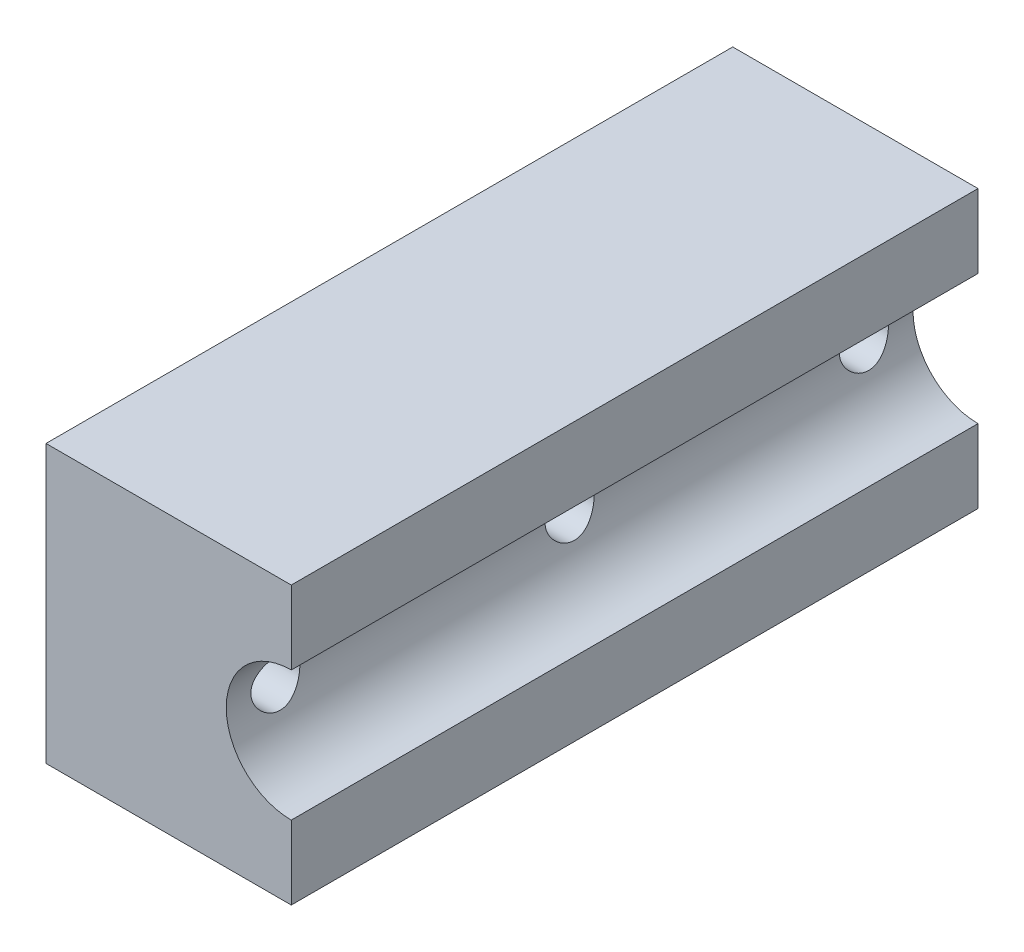
ISO-10303-21;
HEADER;
FILE_DESCRIPTION(('STEP AP214'),'2;1');
FILE_NAME('part.step','',(''),(''),'','','');
FILE_SCHEMA(('AUTOMOTIVE_DESIGN { 1 0 10303 214 1 1 1 1 }'));
ENDSEC;
DATA;
#1=APPLICATION_CONTEXT('core data for automotive mechanical design processes');
#2=APPLICATION_PROTOCOL_DEFINITION('international standard','automotive_design',2000,#1);
#3=PRODUCT_CONTEXT('',#1,'mechanical');
#4=PRODUCT('Part','Part','',(#3));
#5=PRODUCT_RELATED_PRODUCT_CATEGORY('part','',(#4));
#6=PRODUCT_DEFINITION_FORMATION('','',#4);
#7=PRODUCT_DEFINITION_CONTEXT('part definition',#1,'design');
#8=PRODUCT_DEFINITION('design','',#6,#7);
#9=PRODUCT_DEFINITION_SHAPE('','',#8);
#10=(LENGTH_UNIT() NAMED_UNIT(*) SI_UNIT(.MILLI.,.METRE.));
#11=(NAMED_UNIT(*) PLANE_ANGLE_UNIT() SI_UNIT($,.RADIAN.));
#12=(NAMED_UNIT(*) SI_UNIT($,.STERADIAN.) SOLID_ANGLE_UNIT());
#13=UNCERTAINTY_MEASURE_WITH_UNIT(LENGTH_MEASURE(1.E-05),#10,'distance_accuracy_value','');
#14=(GEOMETRIC_REPRESENTATION_CONTEXT(3) GLOBAL_UNCERTAINTY_ASSIGNED_CONTEXT((#13)) GLOBAL_UNIT_ASSIGNED_CONTEXT((#10,
#11,#12)) REPRESENTATION_CONTEXT('',''));
#15=CARTESIAN_POINT('',(0.,0.,0.));
#16=DIRECTION('',(0.,0.,1.));
#17=DIRECTION('',(1.,0.,0.));
#18=AXIS2_PLACEMENT_3D('',#15,#16,#17);
#19=CARTESIAN_POINT('',(0.,0.,70.));
#20=DIRECTION('',(0.,0.,-1.));
#21=DIRECTION('',(-1.,0.,0.));
#22=AXIS2_PLACEMENT_3D('',#19,#20,#21);
#23=CYLINDRICAL_SURFACE('',#22,6.625);
#24=CARTESIAN_POINT('',(-6.625,0.,7.50000000000001));
#25=CARTESIAN_POINT('',(-6.62500386087897,-0.135331242788956,7.50000512985186));
#26=CARTESIAN_POINT('',(-6.62081736773365,-0.270627583206819,7.48897702892336));
#27=CARTESIAN_POINT('',(-6.60453545591861,-0.537173563747288,7.4453372404778));
#28=CARTESIAN_POINT('',(-6.59244128596513,-0.668423839365584,7.4127289607178));
#29=CARTESIAN_POINT('',(-6.56164121550712,-0.9229948725632,7.32724851868353));
#30=CARTESIAN_POINT('',(-6.54294817273658,-1.04633050322921,7.27441574653811));
#31=CARTESIAN_POINT('',(-6.50080955916784,-1.28237820422114,7.15018771162951));
#32=CARTESIAN_POINT('',(-6.47736269723475,-1.39508737619644,7.07878740444106));
#33=CARTESIAN_POINT('',(-6.42700955555377,-1.61152122316881,6.91625091737703));
#34=CARTESIAN_POINT('',(-6.40000452099443,-1.71472948653934,6.82445796842654));
#35=CARTESIAN_POINT('',(-6.3460615105666,-1.90470427196122,6.625136105204));
#36=CARTESIAN_POINT('',(-6.31912355817495,-1.99146566875493,6.51760230412624));
#37=CARTESIAN_POINT('',(-6.26721176276269,-2.14938863521465,6.28478121341616));
#38=CARTESIAN_POINT('',(-6.24235416611246,-2.21981715265987,6.15896817090885));
#39=CARTESIAN_POINT('',(-6.19895631105384,-2.3382848216866,5.89619761519724));
#40=CARTESIAN_POINT('',(-6.18041349394337,-2.38633304450751,5.75924464374351));
#41=CARTESIAN_POINT('',(-6.15280159011874,-2.45663164071429,5.48402905756591));
#42=CARTESIAN_POINT('',(-6.14337180222631,-2.47986843552338,5.34605582502684));
#43=CARTESIAN_POINT('',(-6.13399906236244,-2.5029685716488,5.06787094987363));
#44=CARTESIAN_POINT('',(-6.13405212868233,-2.50284172300894,4.92766027145725));
#45=CARTESIAN_POINT('',(-6.14332840722258,-2.47997182363578,4.65804666327053));
#46=CARTESIAN_POINT('',(-6.15199457081298,-2.45860259926463,4.52850446061097));
#47=CARTESIAN_POINT('',(-6.17659398051639,-2.3961275038719,4.2750024856289));
#48=CARTESIAN_POINT('',(-6.19252833515929,-2.35501862214702,4.15104356802766));
#49=CARTESIAN_POINT('',(-6.23020065468133,-2.25348491012394,3.90944577438924));
#50=CARTESIAN_POINT('',(-6.25204348893585,-2.19270671111446,3.79197247828812));
#51=CARTESIAN_POINT('',(-6.29903729287821,-2.05380611722347,3.5684955920778));
#52=CARTESIAN_POINT('',(-6.32418941358919,-1.97567768111633,3.46249601620264));
#53=CARTESIAN_POINT('',(-6.37705767908482,-1.79802835634703,3.2573786974291));
#54=CARTESIAN_POINT('',(-6.40483176762694,-1.69741271463549,3.15922170031234));
#55=CARTESIAN_POINT('',(-6.45834300080633,-1.48083127736321,2.98088644526116));
#56=CARTESIAN_POINT('',(-6.48407982402111,-1.36486306728671,2.90071102066347));
#57=CARTESIAN_POINT('',(-6.53113989257162,-1.11839263489477,2.75953717442622));
#58=CARTESIAN_POINT('',(-6.55238679434037,-0.987689342867028,2.69886252906309));
#59=CARTESIAN_POINT('',(-6.58750577086024,-0.716928918334148,2.60068253509481));
#60=CARTESIAN_POINT('',(-6.60138116381498,-0.576876026461435,2.56316676054482));
#61=CARTESIAN_POINT('',(-6.61960848472329,-0.299474777832134,2.51422527031827));
#62=CARTESIAN_POINT('',(-6.6244320469505,-0.16238542006459,2.50150605277244));
#63=CARTESIAN_POINT('',(-6.6254722979455,0.112038050190205,2.4987474389708));
#64=CARTESIAN_POINT('',(-6.62169092365961,0.24937210064456,2.50870293870215));
#65=CARTESIAN_POINT('',(-6.60625714149452,0.51477178396597,2.55003086509909));
#66=CARTESIAN_POINT('',(-6.59491754608703,0.642989983978305,2.58055264281897));
#67=CARTESIAN_POINT('',(-6.56582331501934,0.892392701848437,2.66102324724507));
#68=CARTESIAN_POINT('',(-6.54806784542014,1.01357630296733,2.71097459948309));
#69=CARTESIAN_POINT('',(-6.50724096679625,1.24948017014888,2.83048410970311));
#70=CARTESIAN_POINT('',(-6.48402810640822,1.363904043504,2.90057752165688));
#71=CARTESIAN_POINT('',(-6.43484933678375,1.57975110327585,3.05777746835545));
#72=CARTESIAN_POINT('',(-6.40888240385534,1.68116942435244,3.14489033945589));
#73=CARTESIAN_POINT('',(-6.35515814496274,1.87436183008145,3.33967821596547));
#74=CARTESIAN_POINT('',(-6.32738527449593,1.96521901459001,3.44826069076182));
#75=CARTESIAN_POINT('',(-6.27464901149531,2.12760786424604,3.67967243332733));
#76=CARTESIAN_POINT('',(-6.24968588869052,2.19913767493374,3.80250306659102));
#77=CARTESIAN_POINT('',(-6.20548773596825,2.32094532006195,4.0600100824429));
#78=CARTESIAN_POINT('',(-6.18627962988297,2.37112371125722,4.19473843980082));
#79=CARTESIAN_POINT('',(-6.15636958683393,2.44774651636702,4.47166125853009));
#80=CARTESIAN_POINT('',(-6.145662296965,2.47420586735467,4.61385096130372));
#81=CARTESIAN_POINT('',(-6.13468315118732,2.50129586502082,4.89171085149738));
#82=CARTESIAN_POINT('',(-6.13377863439977,2.50349258646585,5.02720459016681));
#83=CARTESIAN_POINT('',(-6.14088224064818,2.48601644778369,5.29652307020521));
#84=CARTESIAN_POINT('',(-6.14888949621946,2.46634571621684,5.43034797273525));
#85=CARTESIAN_POINT('',(-6.17238486878151,2.40691813811135,5.68827446717093));
#86=CARTESIAN_POINT('',(-6.18763100101745,2.36780922925159,5.81254928995308));
#87=CARTESIAN_POINT('',(-6.22374249575118,2.27118936140927,6.05284398793247));
#88=CARTESIAN_POINT('',(-6.24460928697235,2.2136737228934,6.16886175476431));
#89=CARTESIAN_POINT('',(-6.29098388551666,2.07834395575824,6.39602240278915));
#90=CARTESIAN_POINT('',(-6.31667879475512,1.99961707112016,6.50658283590873));
#91=CARTESIAN_POINT('',(-6.36917710855611,1.82550514855999,6.713423377091));
#92=CARTESIAN_POINT('',(-6.39598086558053,1.7301147823944,6.80969889920615));
#93=CARTESIAN_POINT('',(-6.44945013198693,1.51910572245539,6.99064585792878));
#94=CARTESIAN_POINT('',(-6.47602672369091,1.40266229362535,7.07438616376814));
#95=CARTESIAN_POINT('',(-6.52449608561376,1.15642087857481,7.22108742101329));
#96=CARTESIAN_POINT('',(-6.54638839009682,1.02662156634228,7.2840463065614));
#97=CARTESIAN_POINT('',(-6.58388180203265,0.750607869766252,7.38944304950175));
#98=CARTESIAN_POINT('',(-6.59912512722338,0.603902148922053,7.43073386175364));
#99=CARTESIAN_POINT('',(-6.61967947943539,0.304780870616935,7.4860023726813));
#100=CARTESIAN_POINT('',(-6.62499565306868,0.152368313627857,7.49999422434274));
#101=CARTESIAN_POINT('',(-6.625,0.,7.50000000000001));
#102=B_SPLINE_CURVE_WITH_KNOTS('',3,(#24,#25,#26,#27,#28,#29,#30,#31,#32,#33,#34,#35,#36,#37,
#38,#39,#40,#41,#42,#43,#44,#45,#46,#47,#48,#49,#50,#51,#52,#53,#54,#55,#56,#57,#58,#59,#60,#61,
#62,#63,#64,#65,#66,#67,#68,#69,#70,#71,#72,#73,#74,#75,#76,#77,#78,#79,#80,#81,#82,#83,#84,#85,
#86,#87,#88,#89,#90,#91,#92,#93,#94,#95,#96,#97,#98,#99,#100,#101),.UNSPECIFIED.,.T.,.F.,(4,2,2,
2,2,2,2,2,2,2,2,2,2,2,2,2,2,2,2,2,2,2,2,2,2,2,2,2,2,2,2,2,2,2,2,2,2,2,4),(0.,0.405431653728964,
0.810799300433986,1.2153814191331,1.62007356968703,2.04042520831289,2.46090762452414,
2.89765135119826,3.33421790139182,3.75269572547667,4.17099783739419,4.56389874334213,
4.95685959379355,5.35731339795347,5.75790685643296,6.18579027879816,6.61374107499304,
7.04846856406251,7.48300019917169,7.89418469025717,8.30527663405825,8.70033142649296,
9.09543758685846,9.50220704846643,9.9091282401888,10.3399607620231,10.7708346075313,
11.2036938272709,11.6362802618899,12.0407679035702,12.445216176195,12.8370057669302,
13.2288950413599,13.6415130039103,14.0542631457277,14.4897456408027,14.9252714136756,
15.3819803604814,15.8384524662344),.UNSPECIFIED.);
#103=CARTESIAN_POINT('',(-6.625,0.,7.50000000000001));
#104=VERTEX_POINT('',#103);
#105=EDGE_CURVE('E135',#104,#104,#102,.T.);
#106=ORIENTED_EDGE('',*,*,#105,.F.);
#107=EDGE_LOOP('',(#106));
#108=FACE_BOUND('',#107,.T.);
#109=CARTESIAN_POINT('',(-6.625,0.,37.5));
#110=CARTESIAN_POINT('',(-6.62500386087897,-0.135331242788957,37.5000051298519));
#111=CARTESIAN_POINT('',(-6.62081736773365,-0.27062758320682,37.4889770289234));
#112=CARTESIAN_POINT('',(-6.60453545591861,-0.537173563747289,37.4453372404778));
#113=CARTESIAN_POINT('',(-6.59244128596513,-0.668423839365585,37.4127289607178));
#114=CARTESIAN_POINT('',(-6.56164121550712,-0.922994872563201,37.3272485186835));
#115=CARTESIAN_POINT('',(-6.54294817273658,-1.04633050322921,37.2744157465381));
#116=CARTESIAN_POINT('',(-6.50080955916784,-1.28237820422114,37.1501877116295));
#117=CARTESIAN_POINT('',(-6.47736269723475,-1.39508737619644,37.0787874044411));
#118=CARTESIAN_POINT('',(-6.42700955555377,-1.61152122316881,36.916250917377));
#119=CARTESIAN_POINT('',(-6.40000452099443,-1.71472948653934,36.8244579684266));
#120=CARTESIAN_POINT('',(-6.3460615105666,-1.90470427196122,36.625136105204));
#121=CARTESIAN_POINT('',(-6.31912355817495,-1.99146566875493,36.5176023041262));
#122=CARTESIAN_POINT('',(-6.26721176276269,-2.14938863521465,36.2847812134162));
#123=CARTESIAN_POINT('',(-6.24235416611246,-2.21981715265988,36.1589681709088));
#124=CARTESIAN_POINT('',(-6.19895631105384,-2.3382848216866,35.8961976151972));
#125=CARTESIAN_POINT('',(-6.18041349394337,-2.38633304450752,35.7592446437435));
#126=CARTESIAN_POINT('',(-6.15280159011874,-2.45663164071429,35.4840290575659));
#127=CARTESIAN_POINT('',(-6.14337180222631,-2.47986843552339,35.3460558250268));
#128=CARTESIAN_POINT('',(-6.13399906236244,-2.50296857164881,35.0678709498736));
#129=CARTESIAN_POINT('',(-6.13405212868233,-2.50284172300894,34.9276602714572));
#130=CARTESIAN_POINT('',(-6.14332840722258,-2.47997182363578,34.6580466632705));
#131=CARTESIAN_POINT('',(-6.15199457081298,-2.45860259926463,34.528504460611));
#132=CARTESIAN_POINT('',(-6.17659398051639,-2.3961275038719,34.2750024856289));
#133=CARTESIAN_POINT('',(-6.19252833515929,-2.35501862214703,34.1510435680277));
#134=CARTESIAN_POINT('',(-6.23020065468133,-2.25348491012394,33.9094457743892));
#135=CARTESIAN_POINT('',(-6.25204348893585,-2.19270671111446,33.7919724782881));
#136=CARTESIAN_POINT('',(-6.29903729287821,-2.05380611722347,33.5684955920778));
#137=CARTESIAN_POINT('',(-6.32418941358919,-1.97567768111633,33.4624960162026));
#138=CARTESIAN_POINT('',(-6.37705767908481,-1.79802835634703,33.2573786974291));
#139=CARTESIAN_POINT('',(-6.40483176762694,-1.69741271463549,33.1592217003123));
#140=CARTESIAN_POINT('',(-6.45834300080633,-1.48083127736321,32.9808864452612));
#141=CARTESIAN_POINT('',(-6.48407982402111,-1.36486306728671,32.9007110206635));
#142=CARTESIAN_POINT('',(-6.53113989257162,-1.11839263489477,32.7595371744262));
#143=CARTESIAN_POINT('',(-6.55238679434037,-0.987689342867028,32.6988625290631));
#144=CARTESIAN_POINT('',(-6.58750577086024,-0.716928918334148,32.6006825350948));
#145=CARTESIAN_POINT('',(-6.60138116381498,-0.576876026461433,32.5631667605448));
#146=CARTESIAN_POINT('',(-6.61960848472329,-0.299474777832131,32.5142252703183));
#147=CARTESIAN_POINT('',(-6.6244320469505,-0.162385420064587,32.5015060527724));
#148=CARTESIAN_POINT('',(-6.6254722979455,0.112038050190208,32.4987474389708));
#149=CARTESIAN_POINT('',(-6.62169092365961,0.249372100644563,32.5087029387022));
#150=CARTESIAN_POINT('',(-6.60625714149452,0.514771783965973,32.5500308650991));
#151=CARTESIAN_POINT('',(-6.59491754608703,0.642989983978306,32.580552642819));
#152=CARTESIAN_POINT('',(-6.56582331501934,0.892392701848439,32.6610232472451));
#153=CARTESIAN_POINT('',(-6.54806784542014,1.01357630296733,32.7109745994831));
#154=CARTESIAN_POINT('',(-6.50724096679625,1.24948017014889,32.8304841097031));
#155=CARTESIAN_POINT('',(-6.48402810640822,1.363904043504,32.9005775216569));
#156=CARTESIAN_POINT('',(-6.43484933678375,1.57975110327586,33.0577774683555));
#157=CARTESIAN_POINT('',(-6.40888240385534,1.68116942435244,33.1448903394559));
#158=CARTESIAN_POINT('',(-6.35515814496274,1.87436183008146,33.3396782159655));
#159=CARTESIAN_POINT('',(-6.32738527449593,1.96521901459001,33.4482606907618));
#160=CARTESIAN_POINT('',(-6.27464901149531,2.12760786424604,33.6796724333273));
#161=CARTESIAN_POINT('',(-6.24968588869052,2.19913767493375,33.802503066591));
#162=CARTESIAN_POINT('',(-6.20548773596825,2.32094532006196,34.0600100824429));
#163=CARTESIAN_POINT('',(-6.18627962988296,2.37112371125723,34.1947384398008));
#164=CARTESIAN_POINT('',(-6.15636958683393,2.44774651636702,34.4716612585301));
#165=CARTESIAN_POINT('',(-6.145662296965,2.47420586735467,34.6138509613037));
#166=CARTESIAN_POINT('',(-6.13468315118732,2.50129586502082,34.8917108514974));
#167=CARTESIAN_POINT('',(-6.13377863439977,2.50349258646585,35.0272045901668));
#168=CARTESIAN_POINT('',(-6.14088224064818,2.48601644778369,35.2965230702052));
#169=CARTESIAN_POINT('',(-6.14888949621946,2.46634571621684,35.4303479727353));
#170=CARTESIAN_POINT('',(-6.17238486878151,2.40691813811135,35.6882744671709));
#171=CARTESIAN_POINT('',(-6.18763100101745,2.36780922925159,35.8125492899531));
#172=CARTESIAN_POINT('',(-6.22374249575118,2.27118936140927,36.0528439879325));
#173=CARTESIAN_POINT('',(-6.24460928697235,2.2136737228934,36.1688617547643));
#174=CARTESIAN_POINT('',(-6.29098388551666,2.07834395575824,36.3960224027892));
#175=CARTESIAN_POINT('',(-6.31667879475512,1.99961707112016,36.5065828359087));
#176=CARTESIAN_POINT('',(-6.36917710855611,1.82550514855999,36.713423377091));
#177=CARTESIAN_POINT('',(-6.39598086558053,1.7301147823944,36.8096988992062));
#178=CARTESIAN_POINT('',(-6.44945013198693,1.51910572245538,36.9906458579288));
#179=CARTESIAN_POINT('',(-6.47602672369091,1.40266229362535,37.0743861637681));
#180=CARTESIAN_POINT('',(-6.52449608561376,1.15642087857481,37.2210874210133));
#181=CARTESIAN_POINT('',(-6.54638839009683,1.02662156634228,37.2840463065614));
#182=CARTESIAN_POINT('',(-6.58388180203265,0.750607869766248,37.3894430495018));
#183=CARTESIAN_POINT('',(-6.59912512722338,0.60390214892205,37.4307338617537));
#184=CARTESIAN_POINT('',(-6.61967947943539,0.304780870616933,37.4860023726813));
#185=CARTESIAN_POINT('',(-6.62499565306868,0.152368313627857,37.4999942243427));
#186=CARTESIAN_POINT('',(-6.625,0.,37.5));
#187=B_SPLINE_CURVE_WITH_KNOTS('',3,(#109,#110,#111,#112,#113,#114,#115,#116,#117,#118,#119,
#120,#121,#122,#123,#124,#125,#126,#127,#128,#129,#130,#131,#132,#133,#134,#135,#136,#137,#138,
#139,#140,#141,#142,#143,#144,#145,#146,#147,#148,#149,#150,#151,#152,#153,#154,#155,#156,#157,
#158,#159,#160,#161,#162,#163,#164,#165,#166,#167,#168,#169,#170,#171,#172,#173,#174,#175,#176,
#177,#178,#179,#180,#181,#182,#183,#184,#185,#186),.UNSPECIFIED.,.T.,.F.,(4,2,2,2,2,2,2,2,2,2,2,
2,2,2,2,2,2,2,2,2,2,2,2,2,2,2,2,2,2,2,2,2,2,2,2,2,2,2,4),(0.,0.405431653728964,
0.810799300433987,1.2153814191331,1.62007356968703,2.04042520831289,2.46090762452414,
2.89765135119827,3.33421790139182,3.75269572547668,4.17099783739419,4.56389874334213,
4.95685959379356,5.35731339795348,5.75790685643298,6.18579027879816,6.61374107499304,
7.04846856406252,7.4830001991717,7.89418469025718,8.30527663405826,8.70033142649298,
9.09543758685847,9.50220704846644,9.90912824018882,10.3399607620232,10.7708346075313,
11.2036938272709,11.63628026189,12.0407679035702,12.445216176195,12.8370057669302,
13.2288950413599,13.6415130039103,14.0542631457278,14.4897456408027,14.9252714136757,
15.3819803604815,15.8384524662344),.UNSPECIFIED.);
#188=CARTESIAN_POINT('',(-6.625,0.,37.5));
#189=VERTEX_POINT('',#188);
#190=EDGE_CURVE('E178',#189,#189,#187,.T.);
#191=ORIENTED_EDGE('',*,*,#190,.F.);
#192=EDGE_LOOP('',(#191));
#193=FACE_BOUND('',#192,.T.);
#194=CARTESIAN_POINT('',(-6.625,0.,67.5));
#195=CARTESIAN_POINT('',(-6.62500386087897,-0.135331242788955,67.5000051298519));
#196=CARTESIAN_POINT('',(-6.62081736773365,-0.270627583206817,67.4889770289234));
#197=CARTESIAN_POINT('',(-6.60453545591861,-0.537173563747286,67.4453372404778));
#198=CARTESIAN_POINT('',(-6.59244128596513,-0.668423839365583,67.4127289607178));
#199=CARTESIAN_POINT('',(-6.56164121550712,-0.922994872563201,67.3272485186835));
#200=CARTESIAN_POINT('',(-6.54294817273658,-1.04633050322921,67.2744157465381));
#201=CARTESIAN_POINT('',(-6.50080955916784,-1.28237820422114,67.1501877116295));
#202=CARTESIAN_POINT('',(-6.47736269723475,-1.39508737619644,67.078787404441));
#203=CARTESIAN_POINT('',(-6.42700955555377,-1.61152122316881,66.916250917377));
#204=CARTESIAN_POINT('',(-6.40000452099442,-1.71472948653935,66.8244579684265));
#205=CARTESIAN_POINT('',(-6.3460615105666,-1.90470427196122,66.625136105204));
#206=CARTESIAN_POINT('',(-6.31912355817495,-1.99146566875493,66.5176023041262));
#207=CARTESIAN_POINT('',(-6.26721176276269,-2.14938863521464,66.2847812134162));
#208=CARTESIAN_POINT('',(-6.24235416611246,-2.21981715265987,66.1589681709088));
#209=CARTESIAN_POINT('',(-6.19895631105385,-2.33828482168659,65.8961976151972));
#210=CARTESIAN_POINT('',(-6.18041349394337,-2.38633304450751,65.7592446437435));
#211=CARTESIAN_POINT('',(-6.15280159011874,-2.45663164071429,65.4840290575659));
#212=CARTESIAN_POINT('',(-6.14337180222631,-2.47986843552338,65.3460558250268));
#213=CARTESIAN_POINT('',(-6.13399906236245,-2.5029685716488,65.0678709498736));
#214=CARTESIAN_POINT('',(-6.13405212868234,-2.50284172300894,64.9276602714572));
#215=CARTESIAN_POINT('',(-6.14332840722258,-2.47997182363577,64.6580466632705));
#216=CARTESIAN_POINT('',(-6.15199457081298,-2.45860259926463,64.528504460611));
#217=CARTESIAN_POINT('',(-6.17659398051639,-2.39612750387189,64.2750024856289));
#218=CARTESIAN_POINT('',(-6.19252833515929,-2.35501862214702,64.1510435680277));
#219=CARTESIAN_POINT('',(-6.23020065468133,-2.25348491012393,63.9094457743892));
#220=CARTESIAN_POINT('',(-6.25204348893585,-2.19270671111446,63.7919724782881));
#221=CARTESIAN_POINT('',(-6.29903729287821,-2.05380611722347,63.5684955920778));
#222=CARTESIAN_POINT('',(-6.32418941358919,-1.97567768111633,63.4624960162026));
#223=CARTESIAN_POINT('',(-6.37705767908482,-1.79802835634702,63.2573786974291));
#224=CARTESIAN_POINT('',(-6.40483176762694,-1.69741271463549,63.1592217003124));
#225=CARTESIAN_POINT('',(-6.45834300080633,-1.48083127736321,62.9808864452612));
#226=CARTESIAN_POINT('',(-6.48407982402111,-1.36486306728671,62.9007110206635));
#227=CARTESIAN_POINT('',(-6.53113989257161,-1.11839263489477,62.7595371744262));
#228=CARTESIAN_POINT('',(-6.55238679434037,-0.987689342867028,62.6988625290631));
#229=CARTESIAN_POINT('',(-6.58750577086024,-0.716928918334148,62.6006825350948));
#230=CARTESIAN_POINT('',(-6.60138116381498,-0.576876026461435,62.5631667605448));
#231=CARTESIAN_POINT('',(-6.61960848472329,-0.299474777832134,62.5142252703183));
#232=CARTESIAN_POINT('',(-6.6244320469505,-0.16238542006459,62.5015060527724));
#233=CARTESIAN_POINT('',(-6.6254722979455,0.112038050190206,62.4987474389708));
#234=CARTESIAN_POINT('',(-6.62169092365961,0.24937210064456,62.5087029387022));
#235=CARTESIAN_POINT('',(-6.60625714149452,0.51477178396597,62.5500308650991));
#236=CARTESIAN_POINT('',(-6.59491754608703,0.642989983978304,62.580552642819));
#237=CARTESIAN_POINT('',(-6.56582331501934,0.892392701848436,62.6610232472451));
#238=CARTESIAN_POINT('',(-6.54806784542014,1.01357630296733,62.7109745994831));
#239=CARTESIAN_POINT('',(-6.50724096679625,1.24948017014888,62.8304841097031));
#240=CARTESIAN_POINT('',(-6.48402810640822,1.363904043504,62.9005775216569));
#241=CARTESIAN_POINT('',(-6.43484933678375,1.57975110327585,63.0577774683555));
#242=CARTESIAN_POINT('',(-6.40888240385534,1.68116942435244,63.1448903394559));
#243=CARTESIAN_POINT('',(-6.35515814496274,1.87436183008145,63.3396782159655));
#244=CARTESIAN_POINT('',(-6.32738527449593,1.96521901459,63.4482606907618));
#245=CARTESIAN_POINT('',(-6.27464901149532,2.12760786424603,63.6796724333273));
#246=CARTESIAN_POINT('',(-6.24968588869052,2.19913767493374,63.802503066591));
#247=CARTESIAN_POINT('',(-6.20548773596825,2.32094532006195,64.0600100824429));
#248=CARTESIAN_POINT('',(-6.18627962988297,2.37112371125722,64.1947384398008));
#249=CARTESIAN_POINT('',(-6.15636958683393,2.44774651636701,64.4716612585301));
#250=CARTESIAN_POINT('',(-6.14566229696501,2.47420586735466,64.6138509613037));
#251=CARTESIAN_POINT('',(-6.13468315118732,2.50129586502081,64.8917108514974));
#252=CARTESIAN_POINT('',(-6.13377863439977,2.50349258646584,65.0272045901668));
#253=CARTESIAN_POINT('',(-6.14088224064818,2.48601644778369,65.2965230702052));
#254=CARTESIAN_POINT('',(-6.14888949621946,2.46634571621684,65.4303479727352));
#255=CARTESIAN_POINT('',(-6.17238486878152,2.40691813811134,65.6882744671709));
#256=CARTESIAN_POINT('',(-6.18763100101745,2.36780922925159,65.8125492899531));
#257=CARTESIAN_POINT('',(-6.22374249575118,2.27118936140927,66.0528439879325));
#258=CARTESIAN_POINT('',(-6.24460928697235,2.2136737228934,66.1688617547643));
#259=CARTESIAN_POINT('',(-6.29098388551666,2.07834395575825,66.3960224027891));
#260=CARTESIAN_POINT('',(-6.31667879475512,1.99961707112016,66.5065828359087));
#261=CARTESIAN_POINT('',(-6.36917710855611,1.82550514856,66.713423377091));
#262=CARTESIAN_POINT('',(-6.39598086558053,1.73011478239441,66.8096988992061));
#263=CARTESIAN_POINT('',(-6.44945013198692,1.51910572245539,66.9906458579288));
#264=CARTESIAN_POINT('',(-6.47602672369091,1.40266229362535,67.0743861637681));
#265=CARTESIAN_POINT('',(-6.52449608561376,1.15642087857482,67.2210874210133));
#266=CARTESIAN_POINT('',(-6.54638839009682,1.02662156634229,67.2840463065614));
#267=CARTESIAN_POINT('',(-6.58388180203265,0.750607869766256,67.3894430495018));
#268=CARTESIAN_POINT('',(-6.59912512722338,0.603902148922057,67.4307338617536));
#269=CARTESIAN_POINT('',(-6.61967947943539,0.304780870616937,67.4860023726813));
#270=CARTESIAN_POINT('',(-6.62499565306868,0.152368313627859,67.4999942243427));
#271=CARTESIAN_POINT('',(-6.625,0.,67.5));
#272=B_SPLINE_CURVE_WITH_KNOTS('',3,(#194,#195,#196,#197,#198,#199,#200,#201,#202,#203,#204,
#205,#206,#207,#208,#209,#210,#211,#212,#213,#214,#215,#216,#217,#218,#219,#220,#221,#222,#223,
#224,#225,#226,#227,#228,#229,#230,#231,#232,#233,#234,#235,#236,#237,#238,#239,#240,#241,#242,
#243,#244,#245,#246,#247,#248,#249,#250,#251,#252,#253,#254,#255,#256,#257,#258,#259,#260,#261,
#262,#263,#264,#265,#266,#267,#268,#269,#270,#271),.UNSPECIFIED.,.T.,.F.,(4,2,2,2,2,2,2,2,2,2,2,
2,2,2,2,2,2,2,2,2,2,2,2,2,2,2,2,2,2,2,2,2,2,2,2,2,2,2,4),(0.,0.405431653728961,
0.810799300433984,1.21538141913311,1.62007356968703,2.0404252083129,2.46090762452414,
2.89765135119825,3.33421790139182,3.75269572547668,4.17099783739418,4.56389874334212,
4.95685959379354,5.35731339795346,5.75790685643296,6.18579027879814,6.61374107499302,
7.04846856406249,7.48300019917167,7.89418469025715,8.30527663405823,8.70033142649295,
9.09543758685844,9.50220704846641,9.90912824018879,10.3399607620231,10.7708346075313,
11.2036938272709,11.6362802618899,12.0407679035701,12.445216176195,12.8370057669301,
13.2288950413598,13.6415130039103,14.0542631457277,14.4897456408027,14.9252714136756,
15.3819803604814,15.8384524662343),.UNSPECIFIED.);
#273=CARTESIAN_POINT('',(-6.625,0.,67.5));
#274=VERTEX_POINT('',#273);
#275=EDGE_CURVE('E199',#274,#274,#272,.T.);
#276=ORIENTED_EDGE('',*,*,#275,.F.);
#277=EDGE_LOOP('',(#276));
#278=FACE_BOUND('',#277,.T.);
#279=CARTESIAN_POINT('',(0.,0.,0.));
#280=DIRECTION('',(0.,0.,1.));
#281=DIRECTION('',(1.,0.,0.));
#282=AXIS2_PLACEMENT_3D('',#279,#280,#281);
#283=CIRCLE('',#282,6.625);
#284=CARTESIAN_POINT('',(0.,6.625,0.));
#285=VERTEX_POINT('',#284);
#286=CARTESIAN_POINT('',(0.,-6.625,0.));
#287=VERTEX_POINT('',#286);
#288=EDGE_CURVE('E131',#285,#287,#283,.T.);
#289=ORIENTED_EDGE('',*,*,#288,.F.);
#290=DIRECTION('',(0.,0.,-1.));
#291=VECTOR('',#290,1.);
#292=CARTESIAN_POINT('',(0.,6.625,70.));
#293=LINE('',#292,#291);
#294=CARTESIAN_POINT('',(0.,6.625,70.));
#295=VERTEX_POINT('',#294);
#296=EDGE_CURVE('E11',#295,#285,#293,.T.);
#297=ORIENTED_EDGE('',*,*,#296,.F.);
#298=CARTESIAN_POINT('',(0.,0.,70.));
#299=DIRECTION('',(0.,0.,1.));
#300=DIRECTION('',(1.,0.,0.));
#301=AXIS2_PLACEMENT_3D('',#298,#299,#300);
#302=CIRCLE('',#301,6.625);
#303=CARTESIAN_POINT('',(0.,-6.625,70.));
#304=VERTEX_POINT('',#303);
#305=EDGE_CURVE('E166',#295,#304,#302,.T.);
#306=ORIENTED_EDGE('',*,*,#305,.T.);
#307=DIRECTION('',(0.,0.,-1.));
#308=VECTOR('',#307,1.);
#309=CARTESIAN_POINT('',(0.,-6.625,70.));
#310=LINE('',#309,#308);
#311=EDGE_CURVE('E61',#304,#287,#310,.T.);
#312=ORIENTED_EDGE('',*,*,#311,.T.);
#313=EDGE_LOOP('',(#289,#297,#306,#312));
#314=FACE_BOUND('',#313,.T.);
#315=ADVANCED_FACE('F43',(#108,#193,#278,#314),#23,.F.);
#316=CARTESIAN_POINT('',(0.,0.,70.));
#317=DIRECTION('',(1.,0.,0.));
#318=DIRECTION('',(0.,1.,0.));
#319=AXIS2_PLACEMENT_3D('',#316,#317,#318);
#320=PLANE('',#319);
#321=DIRECTION('',(0.,-1.,0.));
#322=VECTOR('',#321,1.);
#323=CARTESIAN_POINT('',(0.,0.,0.));
#324=LINE('',#323,#322);
#325=CARTESIAN_POINT('',(0.,14.125,0.));
#326=VERTEX_POINT('',#325);
#327=EDGE_CURVE('E134',#326,#285,#324,.T.);
#328=ORIENTED_EDGE('',*,*,#327,.F.);
#329=DIRECTION('',(0.,0.,-1.));
#330=VECTOR('',#329,1.);
#331=CARTESIAN_POINT('',(0.,14.125,70.));
#332=LINE('',#331,#330);
#333=CARTESIAN_POINT('',(0.,14.125,70.));
#334=VERTEX_POINT('',#333);
#335=EDGE_CURVE('E53',#334,#326,#332,.T.);
#336=ORIENTED_EDGE('',*,*,#335,.F.);
#337=DIRECTION('',(0.,-1.,0.));
#338=VECTOR('',#337,1.);
#339=CARTESIAN_POINT('',(0.,0.,70.));
#340=LINE('',#339,#338);
#341=EDGE_CURVE('E127',#334,#295,#340,.T.);
#342=ORIENTED_EDGE('',*,*,#341,.T.);
#343=ORIENTED_EDGE('',*,*,#296,.T.);
#344=EDGE_LOOP('',(#328,#336,#342,#343));
#345=FACE_BOUND('',#344,.T.);
#346=ADVANCED_FACE('F161',(#345),#320,.T.);
#347=CARTESIAN_POINT('',(0.,14.125,70.));
#348=DIRECTION('',(0.,1.,0.));
#349=DIRECTION('',(-1.,0.,0.));
#350=AXIS2_PLACEMENT_3D('',#347,#348,#349);
#351=PLANE('',#350);
#352=DIRECTION('',(1.,0.,0.));
#353=VECTOR('',#352,1.);
#354=CARTESIAN_POINT('',(0.,14.125,0.));
#355=LINE('',#354,#353);
#356=CARTESIAN_POINT('',(-25.,14.125,0.));
#357=VERTEX_POINT('',#356);
#358=EDGE_CURVE('E139',#357,#326,#355,.T.);
#359=ORIENTED_EDGE('',*,*,#358,.F.);
#360=DIRECTION('',(0.,0.,-1.));
#361=VECTOR('',#360,1.);
#362=CARTESIAN_POINT('',(-25.,14.125,70.));
#363=LINE('',#362,#361);
#364=CARTESIAN_POINT('',(-25.,14.125,70.));
#365=VERTEX_POINT('',#364);
#366=EDGE_CURVE('E110',#365,#357,#363,.T.);
#367=ORIENTED_EDGE('',*,*,#366,.F.);
#368=DIRECTION('',(1.,0.,0.));
#369=VECTOR('',#368,1.);
#370=CARTESIAN_POINT('',(0.,14.125,70.));
#371=LINE('',#370,#369);
#372=EDGE_CURVE('E123',#365,#334,#371,.T.);
#373=ORIENTED_EDGE('',*,*,#372,.T.);
#374=ORIENTED_EDGE('',*,*,#335,.T.);
#375=EDGE_LOOP('',(#359,#367,#373,#374));
#376=FACE_BOUND('',#375,.T.);
#377=ADVANCED_FACE('F158',(#376),#351,.T.);
#378=CARTESIAN_POINT('',(-25.,0.,70.));
#379=DIRECTION('',(-1.,0.,0.));
#380=DIRECTION('',(0.,-1.,0.));
#381=AXIS2_PLACEMENT_3D('',#378,#379,#380);
#382=PLANE('',#381);
#383=CARTESIAN_POINT('',(-25.,0.,5.));
#384=DIRECTION('',(-1.,0.,0.));
#385=DIRECTION('',(0.,0.,1.));
#386=AXIS2_PLACEMENT_3D('',#383,#384,#385);
#387=CIRCLE('',#386,2.5);
#388=CARTESIAN_POINT('',(-25.,0.,7.5));
#389=VERTEX_POINT('',#388);
#390=EDGE_CURVE('E206',#389,#389,#387,.T.);
#391=ORIENTED_EDGE('',*,*,#390,.F.);
#392=EDGE_LOOP('',(#391));
#393=FACE_BOUND('',#392,.T.);
#394=CARTESIAN_POINT('',(-25.,0.,35.));
#395=DIRECTION('',(-1.,0.,0.));
#396=DIRECTION('',(0.,0.,1.));
#397=AXIS2_PLACEMENT_3D('',#394,#395,#396);
#398=CIRCLE('',#397,2.5);
#399=CARTESIAN_POINT('',(-25.,0.,37.5));
#400=VERTEX_POINT('',#399);
#401=EDGE_CURVE('E211',#400,#400,#398,.T.);
#402=ORIENTED_EDGE('',*,*,#401,.F.);
#403=EDGE_LOOP('',(#402));
#404=FACE_BOUND('',#403,.T.);
#405=CARTESIAN_POINT('',(-25.,0.,65.));
#406=DIRECTION('',(-1.,0.,0.));
#407=DIRECTION('',(0.,0.,1.));
#408=AXIS2_PLACEMENT_3D('',#405,#406,#407);
#409=CIRCLE('',#408,2.5);
#410=CARTESIAN_POINT('',(-25.,0.,67.5));
#411=VERTEX_POINT('',#410);
#412=EDGE_CURVE('E207',#411,#411,#409,.T.);
#413=ORIENTED_EDGE('',*,*,#412,.F.);
#414=EDGE_LOOP('',(#413));
#415=FACE_BOUND('',#414,.T.);
#416=DIRECTION('',(0.,1.,0.));
#417=VECTOR('',#416,1.);
#418=CARTESIAN_POINT('',(-25.,0.,0.));
#419=LINE('',#418,#417);
#420=CARTESIAN_POINT('',(-25.,-14.125,0.));
#421=VERTEX_POINT('',#420);
#422=EDGE_CURVE('E106',#421,#357,#419,.T.);
#423=ORIENTED_EDGE('',*,*,#422,.F.);
#424=DIRECTION('',(0.,0.,-1.));
#425=VECTOR('',#424,1.);
#426=CARTESIAN_POINT('',(-25.,-14.125,70.));
#427=LINE('',#426,#425);
#428=CARTESIAN_POINT('',(-25.,-14.125,70.));
#429=VERTEX_POINT('',#428);
#430=EDGE_CURVE('E100',#429,#421,#427,.T.);
#431=ORIENTED_EDGE('',*,*,#430,.F.);
#432=DIRECTION('',(0.,1.,0.));
#433=VECTOR('',#432,1.);
#434=CARTESIAN_POINT('',(-25.,0.,70.));
#435=LINE('',#434,#433);
#436=EDGE_CURVE('E104',#429,#365,#435,.T.);
#437=ORIENTED_EDGE('',*,*,#436,.T.);
#438=ORIENTED_EDGE('',*,*,#366,.T.);
#439=EDGE_LOOP('',(#423,#431,#437,#438));
#440=FACE_BOUND('',#439,.T.);
#441=ADVANCED_FACE('F102',(#393,#404,#415,#440),#382,.T.);
#442=CARTESIAN_POINT('',(0.,-14.125,70.));
#443=DIRECTION('',(0.,1.,0.));
#444=DIRECTION('',(-1.,0.,0.));
#445=AXIS2_PLACEMENT_3D('',#442,#443,#444);
#446=PLANE('',#445);
#447=DIRECTION('',(1.,0.,0.));
#448=VECTOR('',#447,1.);
#449=CARTESIAN_POINT('',(0.,-14.125,0.));
#450=LINE('',#449,#448);
#451=CARTESIAN_POINT('',(0.,-14.125,0.));
#452=VERTEX_POINT('',#451);
#453=EDGE_CURVE('E146',#421,#452,#450,.T.);
#454=ORIENTED_EDGE('',*,*,#453,.T.);
#455=DIRECTION('',(0.,0.,-1.));
#456=VECTOR('',#455,1.);
#457=CARTESIAN_POINT('',(0.,-14.125,70.));
#458=LINE('',#457,#456);
#459=CARTESIAN_POINT('',(0.,-14.125,70.));
#460=VERTEX_POINT('',#459);
#461=EDGE_CURVE('E81',#460,#452,#458,.T.);
#462=ORIENTED_EDGE('',*,*,#461,.F.);
#463=DIRECTION('',(1.,0.,0.));
#464=VECTOR('',#463,1.);
#465=CARTESIAN_POINT('',(0.,-14.125,70.));
#466=LINE('',#465,#464);
#467=EDGE_CURVE('E112',#429,#460,#466,.T.);
#468=ORIENTED_EDGE('',*,*,#467,.F.);
#469=ORIENTED_EDGE('',*,*,#430,.T.);
#470=EDGE_LOOP('',(#454,#462,#468,#469));
#471=FACE_BOUND('',#470,.T.);
#472=ADVANCED_FACE('F113',(#471),#446,.F.);
#473=EDGE_CURVE('E140',#287,#452,#324,.T.);
#474=ORIENTED_EDGE('',*,*,#473,.F.);
#475=ORIENTED_EDGE('',*,*,#311,.F.);
#476=EDGE_CURVE('E117',#304,#460,#340,.T.);
#477=ORIENTED_EDGE('',*,*,#476,.T.);
#478=ORIENTED_EDGE('',*,*,#461,.T.);
#479=EDGE_LOOP('',(#474,#475,#477,#478));
#480=FACE_BOUND('',#479,.T.);
#481=ADVANCED_FACE('F232',(#480),#320,.T.);
#482=CARTESIAN_POINT('',(0.,0.,70.));
#483=DIRECTION('',(0.,0.,1.));
#484=DIRECTION('',(1.,0.,0.));
#485=AXIS2_PLACEMENT_3D('',#482,#483,#484);
#486=PLANE('',#485);
#487=ORIENTED_EDGE('',*,*,#305,.F.);
#488=ORIENTED_EDGE('',*,*,#341,.F.);
#489=ORIENTED_EDGE('',*,*,#372,.F.);
#490=ORIENTED_EDGE('',*,*,#436,.F.);
#491=ORIENTED_EDGE('',*,*,#467,.T.);
#492=ORIENTED_EDGE('',*,*,#476,.F.);
#493=EDGE_LOOP('',(#487,#488,#489,#490,#491,#492));
#494=FACE_BOUND('',#493,.T.);
#495=ADVANCED_FACE('F120',(#494),#486,.T.);
#496=CARTESIAN_POINT('',(0.,0.,0.));
#497=DIRECTION('',(0.,0.,1.));
#498=DIRECTION('',(1.,0.,0.));
#499=AXIS2_PLACEMENT_3D('',#496,#497,#498);
#500=PLANE('',#499);
#501=ORIENTED_EDGE('',*,*,#288,.T.);
#502=ORIENTED_EDGE('',*,*,#473,.T.);
#503=ORIENTED_EDGE('',*,*,#453,.F.);
#504=ORIENTED_EDGE('',*,*,#422,.T.);
#505=ORIENTED_EDGE('',*,*,#358,.T.);
#506=ORIENTED_EDGE('',*,*,#327,.T.);
#507=EDGE_LOOP('',(#501,#502,#503,#504,#505,#506));
#508=FACE_BOUND('',#507,.T.);
#509=ADVANCED_FACE('F163',(#508),#500,.F.);
#510=CARTESIAN_POINT('',(0.,0.,65.));
#511=DIRECTION('',(-1.,0.,0.));
#512=DIRECTION('',(0.,0.,1.));
#513=AXIS2_PLACEMENT_3D('',#510,#511,#512);
#514=CYLINDRICAL_SURFACE('',#513,2.5);
#515=ORIENTED_EDGE('',*,*,#275,.T.);
#516=EDGE_LOOP('',(#515));
#517=FACE_BOUND('',#516,.T.);
#518=ORIENTED_EDGE('',*,*,#412,.T.);
#519=EDGE_LOOP('',(#518));
#520=FACE_BOUND('',#519,.T.);
#521=ADVANCED_FACE('F192',(#517,#520),#514,.F.);
#522=CARTESIAN_POINT('',(0.,0.,35.));
#523=DIRECTION('',(-1.,0.,0.));
#524=DIRECTION('',(0.,0.,1.));
#525=AXIS2_PLACEMENT_3D('',#522,#523,#524);
#526=CYLINDRICAL_SURFACE('',#525,2.5);
#527=ORIENTED_EDGE('',*,*,#190,.T.);
#528=EDGE_LOOP('',(#527));
#529=FACE_BOUND('',#528,.T.);
#530=ORIENTED_EDGE('',*,*,#401,.T.);
#531=EDGE_LOOP('',(#530));
#532=FACE_BOUND('',#531,.T.);
#533=ADVANCED_FACE('F187',(#529,#532),#526,.F.);
#534=CARTESIAN_POINT('',(0.,0.,5.));
#535=DIRECTION('',(-1.,0.,0.));
#536=DIRECTION('',(0.,0.,1.));
#537=AXIS2_PLACEMENT_3D('',#534,#535,#536);
#538=CYLINDRICAL_SURFACE('',#537,2.5);
#539=ORIENTED_EDGE('',*,*,#105,.T.);
#540=EDGE_LOOP('',(#539));
#541=FACE_BOUND('',#540,.T.);
#542=ORIENTED_EDGE('',*,*,#390,.T.);
#543=EDGE_LOOP('',(#542));
#544=FACE_BOUND('',#543,.T.);
#545=ADVANCED_FACE('F184',(#541,#544),#538,.F.);
#546=CLOSED_SHELL('',(#315,#346,#377,#441,#472,#481,#495,#509,#521,#533,#545));
#547=MANIFOLD_SOLID_BREP('B2',#546);
#548=ADVANCED_BREP_SHAPE_REPRESENTATION('',(#18,#547),#14);
#549=SHAPE_DEFINITION_REPRESENTATION(#9,#548);
ENDSEC;
END-ISO-10303-21;
